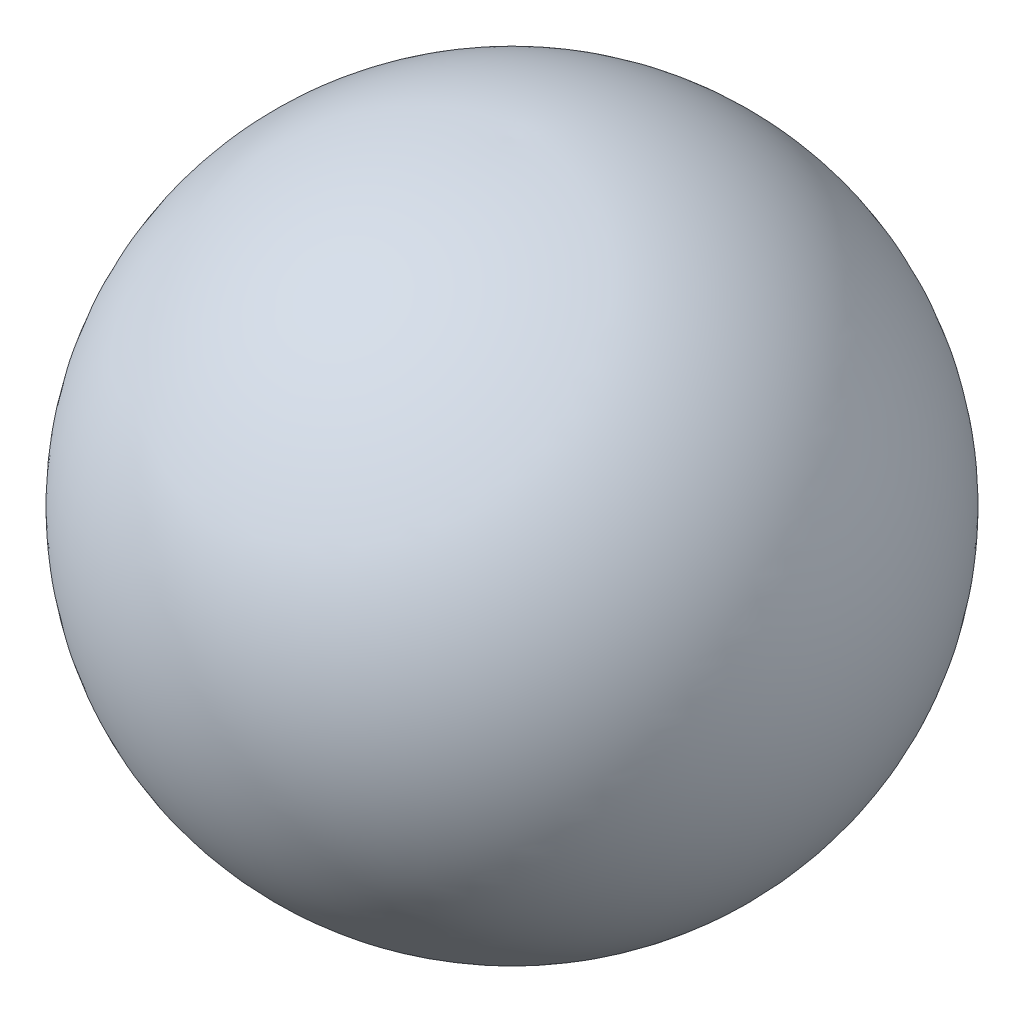
ISO-10303-21;
HEADER;
FILE_DESCRIPTION(('STEP AP214'),'2;1');
FILE_NAME('part.step','',(''),(''),'','','');
FILE_SCHEMA(('AUTOMOTIVE_DESIGN { 1 0 10303 214 1 1 1 1 }'));
ENDSEC;
DATA;
#1=APPLICATION_CONTEXT('core data for automotive mechanical design processes');
#2=APPLICATION_PROTOCOL_DEFINITION('international standard','automotive_design',2000,#1);
#3=PRODUCT_CONTEXT('',#1,'mechanical');
#4=PRODUCT('Part','Part','',(#3));
#5=PRODUCT_RELATED_PRODUCT_CATEGORY('part','',(#4));
#6=PRODUCT_DEFINITION_FORMATION('','',#4);
#7=PRODUCT_DEFINITION_CONTEXT('part definition',#1,'design');
#8=PRODUCT_DEFINITION('design','',#6,#7);
#9=PRODUCT_DEFINITION_SHAPE('','',#8);
#10=(LENGTH_UNIT() NAMED_UNIT(*) SI_UNIT(.MILLI.,.METRE.));
#11=(NAMED_UNIT(*) PLANE_ANGLE_UNIT() SI_UNIT($,.RADIAN.));
#12=(NAMED_UNIT(*) SI_UNIT($,.STERADIAN.) SOLID_ANGLE_UNIT());
#13=UNCERTAINTY_MEASURE_WITH_UNIT(LENGTH_MEASURE(1.E-05),#10,'distance_accuracy_value','');
#14=(GEOMETRIC_REPRESENTATION_CONTEXT(3) GLOBAL_UNCERTAINTY_ASSIGNED_CONTEXT((#13)) GLOBAL_UNIT_ASSIGNED_CONTEXT((#10,
#11,#12)) REPRESENTATION_CONTEXT('',''));
#15=CARTESIAN_POINT('',(0.,0.,0.));
#16=DIRECTION('',(0.,0.,1.));
#17=DIRECTION('',(1.,0.,0.));
#18=AXIS2_PLACEMENT_3D('',#15,#16,#17);
#19=CARTESIAN_POINT('',(0.,0.,0.151272232454732));
#20=DIRECTION('',(-1.,0.,0.));
#21=DIRECTION('',(0.,0.,1.));
#22=AXIS2_PLACEMENT_3D('',#19,#20,#21);
#23=CIRCLE('',#22,4.76490183931546);
#24=TRIMMED_CURVE('',#23,(PARAMETER_VALUE(-1.60254884970034)),
(PARAMETER_VALUE(1.60254884970034)),.T.,.PARAMETER.);
#25=CARTESIAN_POINT('',(0.,0.,0.));
#26=DIRECTION('',(0.,1.,0.));
#27=AXIS1_PLACEMENT('',#25,#26);
#28=SURFACE_OF_REVOLUTION('',#24,#27);
#29=CARTESIAN_POINT('',(0.,4.7625,0.));
#30=VERTEX_POINT('',#29);
#31=VERTEX_LOOP('',#30);
#32=FACE_BOUND('',#31,.T.);
#33=CARTESIAN_POINT('',(0.,-4.7625,0.));
#34=VERTEX_POINT('',#33);
#35=VERTEX_LOOP('',#34);
#36=FACE_BOUND('',#35,.T.);
#37=ADVANCED_FACE('F30',(#32,#36),#28,.T.);
#38=CLOSED_SHELL('',(#37));
#39=MANIFOLD_SOLID_BREP('B2',#38);
#40=ADVANCED_BREP_SHAPE_REPRESENTATION('',(#18,#39),#14);
#41=SHAPE_DEFINITION_REPRESENTATION(#9,#40);
ENDSEC;
END-ISO-10303-21;
